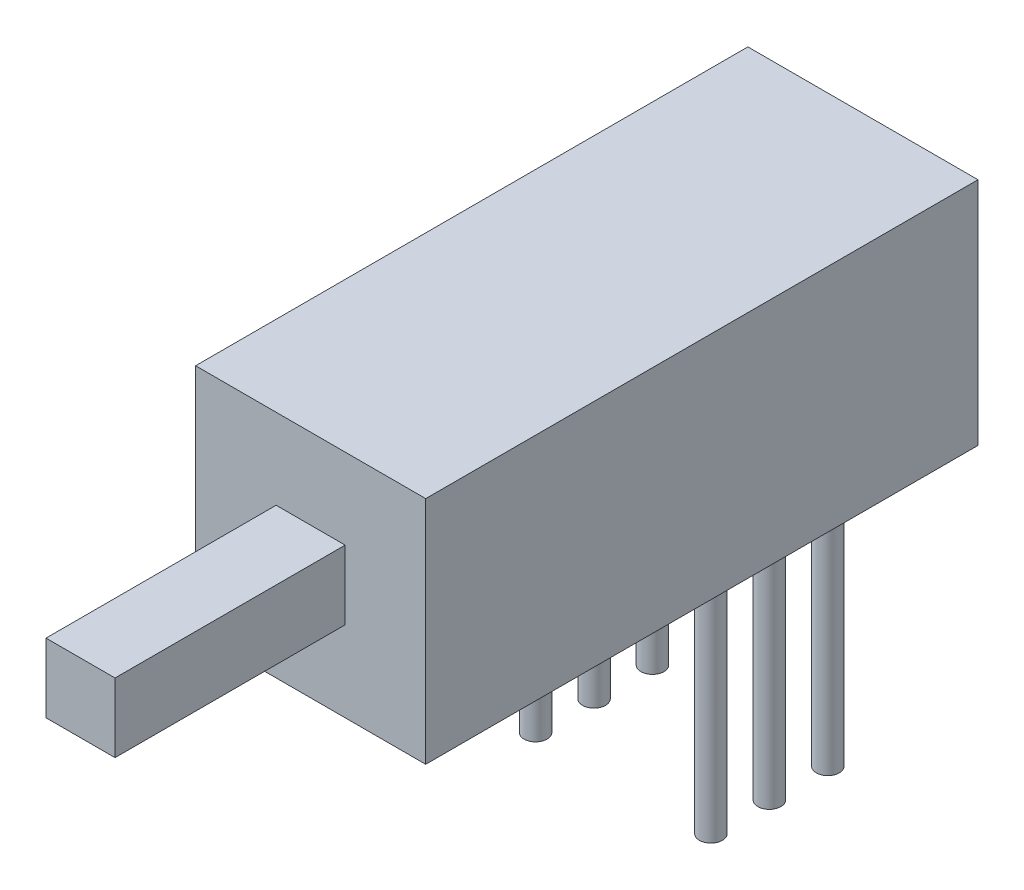
ISO-10303-21;
HEADER;
FILE_DESCRIPTION(('STEP AP214'),'2;1');
FILE_NAME('part.step','',(''),(''),'','','');
FILE_SCHEMA(('AUTOMOTIVE_DESIGN { 1 0 10303 214 1 1 1 1 }'));
ENDSEC;
DATA;
#1=APPLICATION_CONTEXT('core data for automotive mechanical design processes');
#2=APPLICATION_PROTOCOL_DEFINITION('international standard','automotive_design',2000,#1);
#3=PRODUCT_CONTEXT('',#1,'mechanical');
#4=PRODUCT('Part','Part','',(#3));
#5=PRODUCT_RELATED_PRODUCT_CATEGORY('part','',(#4));
#6=PRODUCT_DEFINITION_FORMATION('','',#4);
#7=PRODUCT_DEFINITION_CONTEXT('part definition',#1,'design');
#8=PRODUCT_DEFINITION('design','',#6,#7);
#9=PRODUCT_DEFINITION_SHAPE('','',#8);
#10=(LENGTH_UNIT() NAMED_UNIT(*) SI_UNIT(.MILLI.,.METRE.));
#11=(NAMED_UNIT(*) PLANE_ANGLE_UNIT() SI_UNIT($,.RADIAN.));
#12=(NAMED_UNIT(*) SI_UNIT($,.STERADIAN.) SOLID_ANGLE_UNIT());
#13=UNCERTAINTY_MEASURE_WITH_UNIT(LENGTH_MEASURE(1.E-05),#10,'distance_accuracy_value','');
#14=(GEOMETRIC_REPRESENTATION_CONTEXT(3) GLOBAL_UNCERTAINTY_ASSIGNED_CONTEXT((#13)) GLOBAL_UNIT_ASSIGNED_CONTEXT((#10,
#11,#12)) REPRESENTATION_CONTEXT('',''));
#15=CARTESIAN_POINT('',(0.,0.,0.));
#16=DIRECTION('',(0.,0.,1.));
#17=DIRECTION('',(1.,0.,0.));
#18=AXIS2_PLACEMENT_3D('',#15,#16,#17);
#19=CARTESIAN_POINT('',(-5.,-5.,24.));
#20=DIRECTION('',(-1.,0.,0.));
#21=DIRECTION('',(0.,0.,1.));
#22=AXIS2_PLACEMENT_3D('',#19,#20,#21);
#23=PLANE('',#22);
#24=DIRECTION('',(0.,1.,0.));
#25=VECTOR('',#24,1.);
#26=CARTESIAN_POINT('',(-5.,-5.,0.));
#27=LINE('',#26,#25);
#28=CARTESIAN_POINT('',(-5.,-5.,0.));
#29=VERTEX_POINT('',#28);
#30=CARTESIAN_POINT('',(-5.,5.,0.));
#31=VERTEX_POINT('',#30);
#32=EDGE_CURVE('E132',#29,#31,#27,.T.);
#33=ORIENTED_EDGE('',*,*,#32,.F.);
#34=DIRECTION('',(0.,0.,-1.));
#35=VECTOR('',#34,1.);
#36=CARTESIAN_POINT('',(-5.,-5.,24.));
#37=LINE('',#36,#35);
#38=CARTESIAN_POINT('',(-5.,-5.,24.));
#39=VERTEX_POINT('',#38);
#40=EDGE_CURVE('E158',#39,#29,#37,.T.);
#41=ORIENTED_EDGE('',*,*,#40,.F.);
#42=DIRECTION('',(0.,1.,0.));
#43=VECTOR('',#42,1.);
#44=CARTESIAN_POINT('',(-5.,-5.,24.));
#45=LINE('',#44,#43);
#46=CARTESIAN_POINT('',(-5.,5.,24.));
#47=VERTEX_POINT('',#46);
#48=EDGE_CURVE('E137',#39,#47,#45,.T.);
#49=ORIENTED_EDGE('',*,*,#48,.T.);
#50=DIRECTION('',(0.,0.,-1.));
#51=VECTOR('',#50,1.);
#52=CARTESIAN_POINT('',(-5.,5.,24.));
#53=LINE('',#52,#51);
#54=EDGE_CURVE('E148',#47,#31,#53,.T.);
#55=ORIENTED_EDGE('',*,*,#54,.T.);
#56=EDGE_LOOP('',(#33,#41,#49,#55));
#57=FACE_BOUND('',#56,.T.);
#58=ADVANCED_FACE('F33',(#57),#23,.T.);
#59=CARTESIAN_POINT('',(-5.,-5.,24.));
#60=DIRECTION('',(0.,1.,0.));
#61=DIRECTION('',(0.,0.,1.));
#62=AXIS2_PLACEMENT_3D('',#59,#60,#61);
#63=PLANE('',#62);
#64=CARTESIAN_POINT('',(-3.81,-5.,5.33560606699268));
#65=DIRECTION('',(0.,1.,0.));
#66=DIRECTION('',(0.,0.,1.));
#67=AXIS2_PLACEMENT_3D('',#64,#65,#66);
#68=CIRCLE('',#67,0.500000000000001);
#69=CARTESIAN_POINT('',(-3.81,-5.,5.83560606699268));
#70=VERTEX_POINT('',#69);
#71=EDGE_CURVE('E11',#70,#70,#68,.F.);
#72=ORIENTED_EDGE('',*,*,#71,.F.);
#73=EDGE_LOOP('',(#72));
#74=FACE_BOUND('',#73,.T.);
#75=CARTESIAN_POINT('',(-3.81,-5.,7.87560606699268));
#76=DIRECTION('',(0.,1.,0.));
#77=DIRECTION('',(0.,0.,1.));
#78=AXIS2_PLACEMENT_3D('',#75,#76,#77);
#79=CIRCLE('',#78,0.500000000000001);
#80=CARTESIAN_POINT('',(-3.81,-5.,8.37560606699268));
#81=VERTEX_POINT('',#80);
#82=EDGE_CURVE('E40',#81,#81,#79,.F.);
#83=ORIENTED_EDGE('',*,*,#82,.F.);
#84=EDGE_LOOP('',(#83));
#85=FACE_BOUND('',#84,.T.);
#86=CARTESIAN_POINT('',(3.81,-5.,5.33560606699268));
#87=DIRECTION('',(0.,1.,0.));
#88=DIRECTION('',(0.,0.,1.));
#89=AXIS2_PLACEMENT_3D('',#86,#87,#88);
#90=CIRCLE('',#89,0.500000000000002);
#91=CARTESIAN_POINT('',(3.81,-5.,5.83560606699268));
#92=VERTEX_POINT('',#91);
#93=EDGE_CURVE('E175',#92,#92,#90,.F.);
#94=ORIENTED_EDGE('',*,*,#93,.F.);
#95=EDGE_LOOP('',(#94));
#96=FACE_BOUND('',#95,.T.);
#97=CARTESIAN_POINT('',(3.81,-5.,7.87560606699268));
#98=DIRECTION('',(0.,1.,0.));
#99=DIRECTION('',(0.,0.,1.));
#100=AXIS2_PLACEMENT_3D('',#97,#98,#99);
#101=CIRCLE('',#100,0.500000000000001);
#102=CARTESIAN_POINT('',(3.81,-5.,8.37560606699268));
#103=VERTEX_POINT('',#102);
#104=EDGE_CURVE('E172',#103,#103,#101,.F.);
#105=ORIENTED_EDGE('',*,*,#104,.F.);
#106=EDGE_LOOP('',(#105));
#107=FACE_BOUND('',#106,.T.);
#108=CARTESIAN_POINT('',(3.81,-5.,10.4156060669927));
#109=DIRECTION('',(0.,1.,0.));
#110=DIRECTION('',(0.,0.,1.));
#111=AXIS2_PLACEMENT_3D('',#108,#109,#110);
#112=CIRCLE('',#111,0.500000000000001);
#113=CARTESIAN_POINT('',(3.81,-5.,10.9156060669927));
#114=VERTEX_POINT('',#113);
#115=EDGE_CURVE('E169',#114,#114,#112,.F.);
#116=ORIENTED_EDGE('',*,*,#115,.F.);
#117=EDGE_LOOP('',(#116));
#118=FACE_BOUND('',#117,.T.);
#119=CARTESIAN_POINT('',(-3.81,-5.,10.4156060669927));
#120=DIRECTION('',(0.,1.,0.));
#121=DIRECTION('',(0.,0.,1.));
#122=AXIS2_PLACEMENT_3D('',#119,#120,#121);
#123=CIRCLE('',#122,0.500000000000001);
#124=CARTESIAN_POINT('',(-3.81,-5.,10.9156060669927));
#125=VERTEX_POINT('',#124);
#126=EDGE_CURVE('E160',#125,#125,#123,.F.);
#127=ORIENTED_EDGE('',*,*,#126,.F.);
#128=EDGE_LOOP('',(#127));
#129=FACE_BOUND('',#128,.T.);
#130=DIRECTION('',(1.,0.,0.));
#131=VECTOR('',#130,1.);
#132=CARTESIAN_POINT('',(-5.,-5.,0.));
#133=LINE('',#132,#131);
#134=CARTESIAN_POINT('',(5.,-5.,0.));
#135=VERTEX_POINT('',#134);
#136=EDGE_CURVE('E141',#29,#135,#133,.T.);
#137=ORIENTED_EDGE('',*,*,#136,.T.);
#138=DIRECTION('',(0.,0.,-1.));
#139=VECTOR('',#138,1.);
#140=CARTESIAN_POINT('',(5.,-5.,24.));
#141=LINE('',#140,#139);
#142=CARTESIAN_POINT('',(5.,-5.,24.));
#143=VERTEX_POINT('',#142);
#144=EDGE_CURVE('E161',#143,#135,#141,.T.);
#145=ORIENTED_EDGE('',*,*,#144,.F.);
#146=DIRECTION('',(1.,0.,0.));
#147=VECTOR('',#146,1.);
#148=CARTESIAN_POINT('',(-5.,-5.,24.));
#149=LINE('',#148,#147);
#150=EDGE_CURVE('E146',#39,#143,#149,.T.);
#151=ORIENTED_EDGE('',*,*,#150,.F.);
#152=ORIENTED_EDGE('',*,*,#40,.T.);
#153=EDGE_LOOP('',(#137,#145,#151,#152));
#154=FACE_BOUND('',#153,.T.);
#155=ADVANCED_FACE('F182',(#74,#85,#96,#107,#118,#129,#154),#63,.F.);
#156=CARTESIAN_POINT('',(5.,-5.,24.));
#157=DIRECTION('',(-1.,0.,0.));
#158=DIRECTION('',(0.,0.,1.));
#159=AXIS2_PLACEMENT_3D('',#156,#157,#158);
#160=PLANE('',#159);
#161=DIRECTION('',(0.,1.,0.));
#162=VECTOR('',#161,1.);
#163=CARTESIAN_POINT('',(5.,-5.,0.));
#164=LINE('',#163,#162);
#165=CARTESIAN_POINT('',(5.,5.,0.));
#166=VERTEX_POINT('',#165);
#167=EDGE_CURVE('E154',#135,#166,#164,.T.);
#168=ORIENTED_EDGE('',*,*,#167,.T.);
#169=DIRECTION('',(0.,0.,-1.));
#170=VECTOR('',#169,1.);
#171=CARTESIAN_POINT('',(5.,5.,24.));
#172=LINE('',#171,#170);
#173=CARTESIAN_POINT('',(5.,5.,24.));
#174=VERTEX_POINT('',#173);
#175=EDGE_CURVE('E164',#174,#166,#172,.T.);
#176=ORIENTED_EDGE('',*,*,#175,.F.);
#177=DIRECTION('',(0.,1.,0.));
#178=VECTOR('',#177,1.);
#179=CARTESIAN_POINT('',(5.,-5.,24.));
#180=LINE('',#179,#178);
#181=EDGE_CURVE('E144',#143,#174,#180,.T.);
#182=ORIENTED_EDGE('',*,*,#181,.F.);
#183=ORIENTED_EDGE('',*,*,#144,.T.);
#184=EDGE_LOOP('',(#168,#176,#182,#183));
#185=FACE_BOUND('',#184,.T.);
#186=ADVANCED_FACE('F185',(#185),#160,.F.);
#187=CARTESIAN_POINT('',(-5.,5.,24.));
#188=DIRECTION('',(0.,1.,0.));
#189=DIRECTION('',(0.,0.,1.));
#190=AXIS2_PLACEMENT_3D('',#187,#188,#189);
#191=PLANE('',#190);
#192=DIRECTION('',(1.,0.,0.));
#193=VECTOR('',#192,1.);
#194=CARTESIAN_POINT('',(-5.,5.,0.));
#195=LINE('',#194,#193);
#196=EDGE_CURVE('E151',#31,#166,#195,.T.);
#197=ORIENTED_EDGE('',*,*,#196,.F.);
#198=ORIENTED_EDGE('',*,*,#54,.F.);
#199=DIRECTION('',(1.,0.,0.));
#200=VECTOR('',#199,1.);
#201=CARTESIAN_POINT('',(-5.,5.,24.));
#202=LINE('',#201,#200);
#203=EDGE_CURVE('E140',#47,#174,#202,.T.);
#204=ORIENTED_EDGE('',*,*,#203,.T.);
#205=ORIENTED_EDGE('',*,*,#175,.T.);
#206=EDGE_LOOP('',(#197,#198,#204,#205));
#207=FACE_BOUND('',#206,.T.);
#208=ADVANCED_FACE('F208',(#207),#191,.T.);
#209=CARTESIAN_POINT('',(0.,0.,24.));
#210=DIRECTION('',(0.,0.,-1.));
#211=DIRECTION('',(-1.,0.,0.));
#212=AXIS2_PLACEMENT_3D('',#209,#210,#211);
#213=PLANE('',#212);
#214=DIRECTION('',(1.,0.,0.));
#215=VECTOR('',#214,1.);
#216=CARTESIAN_POINT('',(-1.5,-1.5,24.));
#217=LINE('',#216,#215);
#218=CARTESIAN_POINT('',(-1.5,-1.5,24.));
#219=VERTEX_POINT('',#218);
#220=CARTESIAN_POINT('',(1.5,-1.5,24.));
#221=VERTEX_POINT('',#220);
#222=EDGE_CURVE('E116',#219,#221,#217,.T.);
#223=ORIENTED_EDGE('',*,*,#222,.F.);
#224=DIRECTION('',(0.,1.,0.));
#225=VECTOR('',#224,1.);
#226=CARTESIAN_POINT('',(-1.5,-1.5,24.));
#227=LINE('',#226,#225);
#228=CARTESIAN_POINT('',(-1.5,1.5,24.));
#229=VERTEX_POINT('',#228);
#230=EDGE_CURVE('E47',#219,#229,#227,.T.);
#231=ORIENTED_EDGE('',*,*,#230,.T.);
#232=DIRECTION('',(1.,0.,0.));
#233=VECTOR('',#232,1.);
#234=CARTESIAN_POINT('',(-1.5,1.5,24.));
#235=LINE('',#234,#233);
#236=CARTESIAN_POINT('',(1.5,1.5,24.));
#237=VERTEX_POINT('',#236);
#238=EDGE_CURVE('E52',#229,#237,#235,.T.);
#239=ORIENTED_EDGE('',*,*,#238,.T.);
#240=DIRECTION('',(0.,1.,0.));
#241=VECTOR('',#240,1.);
#242=CARTESIAN_POINT('',(1.5,-1.5,24.));
#243=LINE('',#242,#241);
#244=EDGE_CURVE('E119',#221,#237,#243,.T.);
#245=ORIENTED_EDGE('',*,*,#244,.F.);
#246=EDGE_LOOP('',(#223,#231,#239,#245));
#247=FACE_BOUND('',#246,.T.);
#248=ORIENTED_EDGE('',*,*,#48,.F.);
#249=ORIENTED_EDGE('',*,*,#150,.T.);
#250=ORIENTED_EDGE('',*,*,#181,.T.);
#251=ORIENTED_EDGE('',*,*,#203,.F.);
#252=EDGE_LOOP('',(#248,#249,#250,#251));
#253=FACE_BOUND('',#252,.T.);
#254=ADVANCED_FACE('F212',(#247,#253),#213,.F.);
#255=CARTESIAN_POINT('',(0.,0.,0.));
#256=DIRECTION('',(0.,0.,-1.));
#257=DIRECTION('',(-1.,0.,0.));
#258=AXIS2_PLACEMENT_3D('',#255,#256,#257);
#259=PLANE('',#258);
#260=ORIENTED_EDGE('',*,*,#32,.T.);
#261=ORIENTED_EDGE('',*,*,#196,.T.);
#262=ORIENTED_EDGE('',*,*,#167,.F.);
#263=ORIENTED_EDGE('',*,*,#136,.F.);
#264=EDGE_LOOP('',(#260,#261,#262,#263));
#265=FACE_BOUND('',#264,.T.);
#266=ADVANCED_FACE('F205',(#265),#259,.T.);
#267=CARTESIAN_POINT('',(-1.5,-1.5,34.));
#268=DIRECTION('',(-1.,0.,0.));
#269=DIRECTION('',(0.,0.,1.));
#270=AXIS2_PLACEMENT_3D('',#267,#268,#269);
#271=PLANE('',#270);
#272=ORIENTED_EDGE('',*,*,#230,.F.);
#273=DIRECTION('',(0.,0.,-1.));
#274=VECTOR('',#273,1.);
#275=CARTESIAN_POINT('',(-1.5,-1.5,34.));
#276=LINE('',#275,#274);
#277=CARTESIAN_POINT('',(-1.5,-1.5,34.));
#278=VERTEX_POINT('',#277);
#279=EDGE_CURVE('E114',#278,#219,#276,.T.);
#280=ORIENTED_EDGE('',*,*,#279,.F.);
#281=DIRECTION('',(0.,1.,0.));
#282=VECTOR('',#281,1.);
#283=CARTESIAN_POINT('',(-1.5,-1.5,34.));
#284=LINE('',#283,#282);
#285=CARTESIAN_POINT('',(-1.5,1.5,34.));
#286=VERTEX_POINT('',#285);
#287=EDGE_CURVE('E107',#278,#286,#284,.T.);
#288=ORIENTED_EDGE('',*,*,#287,.T.);
#289=DIRECTION('',(0.,0.,-1.));
#290=VECTOR('',#289,1.);
#291=CARTESIAN_POINT('',(-1.5,1.5,34.));
#292=LINE('',#291,#290);
#293=EDGE_CURVE('E95',#286,#229,#292,.T.);
#294=ORIENTED_EDGE('',*,*,#293,.T.);
#295=EDGE_LOOP('',(#272,#280,#288,#294));
#296=FACE_BOUND('',#295,.T.);
#297=ADVANCED_FACE('F112',(#296),#271,.T.);
#298=CARTESIAN_POINT('',(-1.5,-1.5,34.));
#299=DIRECTION('',(0.,1.,0.));
#300=DIRECTION('',(0.,0.,1.));
#301=AXIS2_PLACEMENT_3D('',#298,#299,#300);
#302=PLANE('',#301);
#303=ORIENTED_EDGE('',*,*,#222,.T.);
#304=DIRECTION('',(0.,0.,-1.));
#305=VECTOR('',#304,1.);
#306=CARTESIAN_POINT('',(1.5,-1.5,34.));
#307=LINE('',#306,#305);
#308=CARTESIAN_POINT('',(1.5,-1.5,34.));
#309=VERTEX_POINT('',#308);
#310=EDGE_CURVE('E133',#309,#221,#307,.T.);
#311=ORIENTED_EDGE('',*,*,#310,.F.);
#312=DIRECTION('',(1.,0.,0.));
#313=VECTOR('',#312,1.);
#314=CARTESIAN_POINT('',(-1.5,-1.5,34.));
#315=LINE('',#314,#313);
#316=EDGE_CURVE('E102',#278,#309,#315,.T.);
#317=ORIENTED_EDGE('',*,*,#316,.F.);
#318=ORIENTED_EDGE('',*,*,#279,.T.);
#319=EDGE_LOOP('',(#303,#311,#317,#318));
#320=FACE_BOUND('',#319,.T.);
#321=ADVANCED_FACE('F252',(#320),#302,.F.);
#322=CARTESIAN_POINT('',(1.5,-1.5,34.));
#323=DIRECTION('',(-1.,0.,0.));
#324=DIRECTION('',(0.,0.,1.));
#325=AXIS2_PLACEMENT_3D('',#322,#323,#324);
#326=PLANE('',#325);
#327=ORIENTED_EDGE('',*,*,#244,.T.);
#328=DIRECTION('',(0.,0.,-1.));
#329=VECTOR('',#328,1.);
#330=CARTESIAN_POINT('',(1.5,1.5,34.));
#331=LINE('',#330,#329);
#332=CARTESIAN_POINT('',(1.5,1.5,34.));
#333=VERTEX_POINT('',#332);
#334=EDGE_CURVE('E101',#333,#237,#331,.T.);
#335=ORIENTED_EDGE('',*,*,#334,.F.);
#336=DIRECTION('',(0.,1.,0.));
#337=VECTOR('',#336,1.);
#338=CARTESIAN_POINT('',(1.5,-1.5,34.));
#339=LINE('',#338,#337);
#340=EDGE_CURVE('E109',#309,#333,#339,.T.);
#341=ORIENTED_EDGE('',*,*,#340,.F.);
#342=ORIENTED_EDGE('',*,*,#310,.T.);
#343=EDGE_LOOP('',(#327,#335,#341,#342));
#344=FACE_BOUND('',#343,.T.);
#345=ADVANCED_FACE('F259',(#344),#326,.F.);
#346=CARTESIAN_POINT('',(-1.5,1.5,34.));
#347=DIRECTION('',(0.,1.,0.));
#348=DIRECTION('',(0.,0.,1.));
#349=AXIS2_PLACEMENT_3D('',#346,#347,#348);
#350=PLANE('',#349);
#351=ORIENTED_EDGE('',*,*,#238,.F.);
#352=ORIENTED_EDGE('',*,*,#293,.F.);
#353=DIRECTION('',(1.,0.,0.));
#354=VECTOR('',#353,1.);
#355=CARTESIAN_POINT('',(-1.5,1.5,34.));
#356=LINE('',#355,#354);
#357=EDGE_CURVE('E98',#286,#333,#356,.T.);
#358=ORIENTED_EDGE('',*,*,#357,.T.);
#359=ORIENTED_EDGE('',*,*,#334,.T.);
#360=EDGE_LOOP('',(#351,#352,#358,#359));
#361=FACE_BOUND('',#360,.T.);
#362=ADVANCED_FACE('F97',(#361),#350,.T.);
#363=CARTESIAN_POINT('',(0.,0.,34.));
#364=DIRECTION('',(0.,0.,-1.));
#365=DIRECTION('',(-1.,0.,0.));
#366=AXIS2_PLACEMENT_3D('',#363,#364,#365);
#367=PLANE('',#366);
#368=ORIENTED_EDGE('',*,*,#287,.F.);
#369=ORIENTED_EDGE('',*,*,#316,.T.);
#370=ORIENTED_EDGE('',*,*,#340,.T.);
#371=ORIENTED_EDGE('',*,*,#357,.F.);
#372=EDGE_LOOP('',(#368,#369,#370,#371));
#373=FACE_BOUND('',#372,.T.);
#374=ADVANCED_FACE('F106',(#373),#367,.F.);
#375=CARTESIAN_POINT('',(-3.81,-15.,10.4156060669927));
#376=DIRECTION('',(0.,1.,0.));
#377=DIRECTION('',(0.,0.,1.));
#378=AXIS2_PLACEMENT_3D('',#375,#376,#377);
#379=CYLINDRICAL_SURFACE('',#378,0.500000000000001);
#380=CARTESIAN_POINT('',(-3.81,-15.,10.4156060669927));
#381=DIRECTION('',(0.,-1.,0.));
#382=DIRECTION('',(0.,0.,-1.));
#383=AXIS2_PLACEMENT_3D('',#380,#381,#382);
#384=CIRCLE('',#383,0.500000000000001);
#385=CARTESIAN_POINT('',(-3.81,-15.,9.91560606699268));
#386=VERTEX_POINT('',#385);
#387=EDGE_CURVE('E122',#386,#386,#384,.T.);
#388=ORIENTED_EDGE('',*,*,#387,.F.);
#389=EDGE_LOOP('',(#388));
#390=FACE_BOUND('',#389,.T.);
#391=ORIENTED_EDGE('',*,*,#126,.T.);
#392=EDGE_LOOP('',(#391));
#393=FACE_BOUND('',#392,.T.);
#394=ADVANCED_FACE('F279',(#390,#393),#379,.T.);
#395=CARTESIAN_POINT('',(-3.81,-15.,10.4156060669927));
#396=DIRECTION('',(0.,-1.,0.));
#397=DIRECTION('',(0.,0.,-1.));
#398=AXIS2_PLACEMENT_3D('',#395,#396,#397);
#399=PLANE('',#398);
#400=ORIENTED_EDGE('',*,*,#387,.T.);
#401=EDGE_LOOP('',(#400));
#402=FACE_BOUND('',#401,.T.);
#403=ADVANCED_FACE('F285',(#402),#399,.T.);
#404=CARTESIAN_POINT('',(3.81,-15.,10.4156060669927));
#405=DIRECTION('',(0.,1.,0.));
#406=DIRECTION('',(0.,0.,1.));
#407=AXIS2_PLACEMENT_3D('',#404,#405,#406);
#408=CYLINDRICAL_SURFACE('',#407,0.500000000000001);
#409=CARTESIAN_POINT('',(3.81,-15.,10.4156060669927));
#410=DIRECTION('',(0.,-1.,0.));
#411=DIRECTION('',(0.,0.,-1.));
#412=AXIS2_PLACEMENT_3D('',#409,#410,#411);
#413=CIRCLE('',#412,0.500000000000001);
#414=CARTESIAN_POINT('',(3.81,-15.,9.91560606699268));
#415=VERTEX_POINT('',#414);
#416=EDGE_CURVE('E434',#415,#415,#413,.T.);
#417=ORIENTED_EDGE('',*,*,#416,.F.);
#418=EDGE_LOOP('',(#417));
#419=FACE_BOUND('',#418,.T.);
#420=ORIENTED_EDGE('',*,*,#115,.T.);
#421=EDGE_LOOP('',(#420));
#422=FACE_BOUND('',#421,.T.);
#423=ADVANCED_FACE('F293',(#419,#422),#408,.T.);
#424=CARTESIAN_POINT('',(3.81,-15.,10.4156060669927));
#425=DIRECTION('',(0.,-1.,0.));
#426=DIRECTION('',(0.,0.,-1.));
#427=AXIS2_PLACEMENT_3D('',#424,#425,#426);
#428=PLANE('',#427);
#429=ORIENTED_EDGE('',*,*,#416,.T.);
#430=EDGE_LOOP('',(#429));
#431=FACE_BOUND('',#430,.T.);
#432=ADVANCED_FACE('F301',(#431),#428,.T.);
#433=CARTESIAN_POINT('',(3.81,-15.,7.87560606699268));
#434=DIRECTION('',(0.,1.,0.));
#435=DIRECTION('',(0.,0.,1.));
#436=AXIS2_PLACEMENT_3D('',#433,#434,#435);
#437=CYLINDRICAL_SURFACE('',#436,0.500000000000001);
#438=CARTESIAN_POINT('',(3.81,-15.,7.87560606699268));
#439=DIRECTION('',(0.,-1.,0.));
#440=DIRECTION('',(0.,0.,-1.));
#441=AXIS2_PLACEMENT_3D('',#438,#439,#440);
#442=CIRCLE('',#441,0.500000000000001);
#443=CARTESIAN_POINT('',(3.81,-15.,7.37560606699268));
#444=VERTEX_POINT('',#443);
#445=EDGE_CURVE('E432',#444,#444,#442,.T.);
#446=ORIENTED_EDGE('',*,*,#445,.F.);
#447=EDGE_LOOP('',(#446));
#448=FACE_BOUND('',#447,.T.);
#449=ORIENTED_EDGE('',*,*,#104,.T.);
#450=EDGE_LOOP('',(#449));
#451=FACE_BOUND('',#450,.T.);
#452=ADVANCED_FACE('F309',(#448,#451),#437,.T.);
#453=CARTESIAN_POINT('',(3.81,-15.,7.87560606699268));
#454=DIRECTION('',(0.,-1.,0.));
#455=DIRECTION('',(0.,0.,-1.));
#456=AXIS2_PLACEMENT_3D('',#453,#454,#455);
#457=PLANE('',#456);
#458=ORIENTED_EDGE('',*,*,#445,.T.);
#459=EDGE_LOOP('',(#458));
#460=FACE_BOUND('',#459,.T.);
#461=ADVANCED_FACE('F317',(#460),#457,.T.);
#462=CARTESIAN_POINT('',(3.81,-15.,5.33560606699268));
#463=DIRECTION('',(0.,1.,0.));
#464=DIRECTION('',(0.,0.,1.));
#465=AXIS2_PLACEMENT_3D('',#462,#463,#464);
#466=CYLINDRICAL_SURFACE('',#465,0.500000000000002);
#467=CARTESIAN_POINT('',(3.81,-15.,5.33560606699268));
#468=DIRECTION('',(0.,-1.,0.));
#469=DIRECTION('',(0.,0.,-1.));
#470=AXIS2_PLACEMENT_3D('',#467,#468,#469);
#471=CIRCLE('',#470,0.500000000000002);
#472=CARTESIAN_POINT('',(3.81,-15.,4.83560606699268));
#473=VERTEX_POINT('',#472);
#474=EDGE_CURVE('E427',#473,#473,#471,.T.);
#475=ORIENTED_EDGE('',*,*,#474,.F.);
#476=EDGE_LOOP('',(#475));
#477=FACE_BOUND('',#476,.T.);
#478=ORIENTED_EDGE('',*,*,#93,.T.);
#479=EDGE_LOOP('',(#478));
#480=FACE_BOUND('',#479,.T.);
#481=ADVANCED_FACE('F325',(#477,#480),#466,.T.);
#482=CARTESIAN_POINT('',(3.81,-15.,5.33560606699268));
#483=DIRECTION('',(0.,-1.,0.));
#484=DIRECTION('',(0.,0.,-1.));
#485=AXIS2_PLACEMENT_3D('',#482,#483,#484);
#486=PLANE('',#485);
#487=ORIENTED_EDGE('',*,*,#474,.T.);
#488=EDGE_LOOP('',(#487));
#489=FACE_BOUND('',#488,.T.);
#490=ADVANCED_FACE('F333',(#489),#486,.T.);
#491=CARTESIAN_POINT('',(-3.81,-15.,7.87560606699268));
#492=DIRECTION('',(0.,1.,0.));
#493=DIRECTION('',(0.,0.,1.));
#494=AXIS2_PLACEMENT_3D('',#491,#492,#493);
#495=CYLINDRICAL_SURFACE('',#494,0.500000000000001);
#496=CARTESIAN_POINT('',(-3.81,-15.,7.87560606699268));
#497=DIRECTION('',(0.,-1.,0.));
#498=DIRECTION('',(0.,0.,-1.));
#499=AXIS2_PLACEMENT_3D('',#496,#497,#498);
#500=CIRCLE('',#499,0.500000000000001);
#501=CARTESIAN_POINT('',(-3.81,-15.,7.37560606699268));
#502=VERTEX_POINT('',#501);
#503=EDGE_CURVE('E424',#502,#502,#500,.T.);
#504=ORIENTED_EDGE('',*,*,#503,.F.);
#505=EDGE_LOOP('',(#504));
#506=FACE_BOUND('',#505,.T.);
#507=ORIENTED_EDGE('',*,*,#82,.T.);
#508=EDGE_LOOP('',(#507));
#509=FACE_BOUND('',#508,.T.);
#510=ADVANCED_FACE('F180',(#506,#509),#495,.T.);
#511=CARTESIAN_POINT('',(-3.81,-15.,7.87560606699268));
#512=DIRECTION('',(0.,-1.,0.));
#513=DIRECTION('',(0.,0.,-1.));
#514=AXIS2_PLACEMENT_3D('',#511,#512,#513);
#515=PLANE('',#514);
#516=ORIENTED_EDGE('',*,*,#503,.T.);
#517=EDGE_LOOP('',(#516));
#518=FACE_BOUND('',#517,.T.);
#519=ADVANCED_FACE('F348',(#518),#515,.T.);
#520=CARTESIAN_POINT('',(-3.81,-15.,5.33560606699268));
#521=DIRECTION('',(0.,1.,0.));
#522=DIRECTION('',(0.,0.,1.));
#523=AXIS2_PLACEMENT_3D('',#520,#521,#522);
#524=CYLINDRICAL_SURFACE('',#523,0.500000000000001);
#525=CARTESIAN_POINT('',(-3.81,-15.,5.33560606699268));
#526=DIRECTION('',(0.,-1.,0.));
#527=DIRECTION('',(0.,0.,-1.));
#528=AXIS2_PLACEMENT_3D('',#525,#526,#527);
#529=CIRCLE('',#528,0.500000000000001);
#530=CARTESIAN_POINT('',(-3.81,-15.,4.83560606699268));
#531=VERTEX_POINT('',#530);
#532=EDGE_CURVE('E423',#531,#531,#529,.T.);
#533=ORIENTED_EDGE('',*,*,#532,.F.);
#534=EDGE_LOOP('',(#533));
#535=FACE_BOUND('',#534,.T.);
#536=ORIENTED_EDGE('',*,*,#71,.T.);
#537=EDGE_LOOP('',(#536));
#538=FACE_BOUND('',#537,.T.);
#539=ADVANCED_FACE('F356',(#535,#538),#524,.T.);
#540=CARTESIAN_POINT('',(-3.81,-15.,5.33560606699268));
#541=DIRECTION('',(0.,-1.,0.));
#542=DIRECTION('',(0.,0.,-1.));
#543=AXIS2_PLACEMENT_3D('',#540,#541,#542);
#544=PLANE('',#543);
#545=ORIENTED_EDGE('',*,*,#532,.T.);
#546=EDGE_LOOP('',(#545));
#547=FACE_BOUND('',#546,.T.);
#548=ADVANCED_FACE('F364',(#547),#544,.T.);
#549=CLOSED_SHELL('',(#58,#155,#186,#208,#254,#266,#297,#321,#345,#362,#374,#394,#403,#423,#432,
#452,#461,#481,#490,#510,#519,#539,#548));
#550=MANIFOLD_SOLID_BREP('B2',#549);
#551=ADVANCED_BREP_SHAPE_REPRESENTATION('',(#18,#550),#14);
#552=SHAPE_DEFINITION_REPRESENTATION(#9,#551);
ENDSEC;
END-ISO-10303-21;
